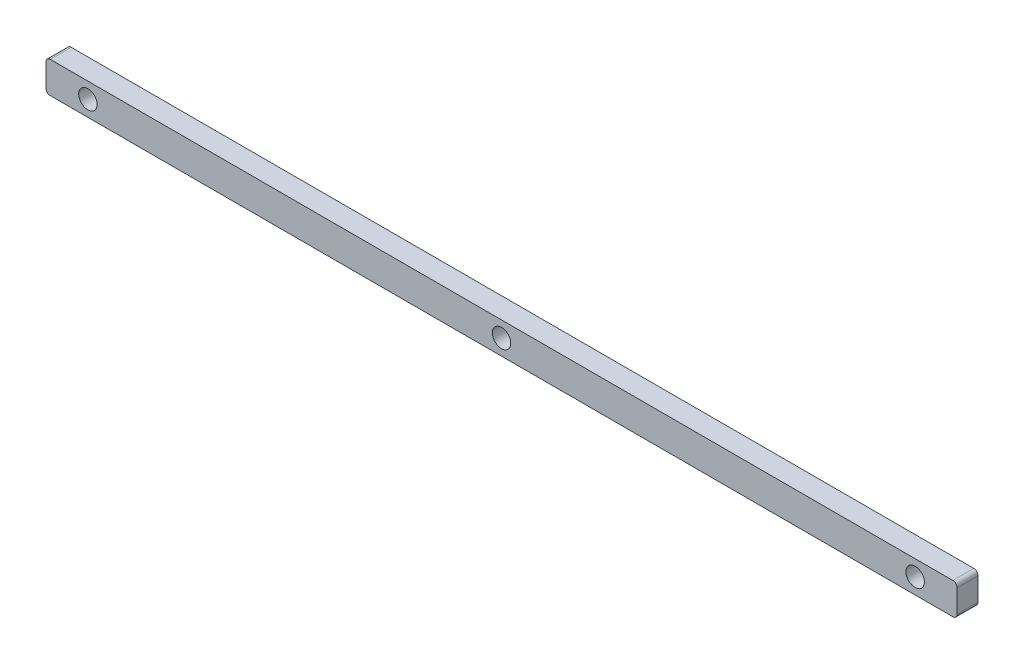
ISO-10303-21;
HEADER;
FILE_DESCRIPTION(('STEP AP214'),'2;1');
FILE_NAME('part.step','',(''),(''),'','','');
FILE_SCHEMA(('AUTOMOTIVE_DESIGN { 1 0 10303 214 1 1 1 1 }'));
ENDSEC;
DATA;
#1=APPLICATION_CONTEXT('core data for automotive mechanical design processes');
#2=APPLICATION_PROTOCOL_DEFINITION('international standard','automotive_design',2000,#1);
#3=PRODUCT_CONTEXT('',#1,'mechanical');
#4=PRODUCT('Part','Part','',(#3));
#5=PRODUCT_RELATED_PRODUCT_CATEGORY('part','',(#4));
#6=PRODUCT_DEFINITION_FORMATION('','',#4);
#7=PRODUCT_DEFINITION_CONTEXT('part definition',#1,'design');
#8=PRODUCT_DEFINITION('design','',#6,#7);
#9=PRODUCT_DEFINITION_SHAPE('','',#8);
#10=(LENGTH_UNIT() NAMED_UNIT(*) SI_UNIT(.MILLI.,.METRE.));
#11=(NAMED_UNIT(*) PLANE_ANGLE_UNIT() SI_UNIT($,.RADIAN.));
#12=(NAMED_UNIT(*) SI_UNIT($,.STERADIAN.) SOLID_ANGLE_UNIT());
#13=UNCERTAINTY_MEASURE_WITH_UNIT(LENGTH_MEASURE(1.E-05),#10,'distance_accuracy_value','');
#14=(GEOMETRIC_REPRESENTATION_CONTEXT(3) GLOBAL_UNCERTAINTY_ASSIGNED_CONTEXT((#13)) GLOBAL_UNIT_ASSIGNED_CONTEXT((#10,
#11,#12)) REPRESENTATION_CONTEXT('',''));
#15=CARTESIAN_POINT('',(0.,0.,0.));
#16=DIRECTION('',(0.,0.,1.));
#17=DIRECTION('',(1.,0.,0.));
#18=AXIS2_PLACEMENT_3D('',#15,#16,#17);
#19=CARTESIAN_POINT('',(0.,0.,6.35));
#20=DIRECTION('',(0.,0.,-1.));
#21=DIRECTION('',(-1.,0.,0.));
#22=AXIS2_PLACEMENT_3D('',#19,#20,#21);
#23=PLANE('',#22);
#24=DIRECTION('',(-1.,0.,0.));
#25=VECTOR('',#24,1.);
#26=CARTESIAN_POINT('',(-276.225,9.52500000000001,6.35));
#27=LINE('',#26,#25);
#28=CARTESIAN_POINT('',(273.685,9.52500000000001,6.35));
#29=VERTEX_POINT('',#28);
#30=CARTESIAN_POINT('',(-273.685,9.52500000000001,6.35));
#31=VERTEX_POINT('',#30);
#32=EDGE_CURVE('E194',#29,#31,#27,.T.);
#33=ORIENTED_EDGE('',*,*,#32,.T.);
#34=CARTESIAN_POINT('',(-273.685,6.985,6.35));
#35=DIRECTION('',(0.,0.,-1.));
#36=DIRECTION('',(-1.,0.,0.));
#37=AXIS2_PLACEMENT_3D('',#34,#35,#36);
#38=CIRCLE('',#37,2.54);
#39=CARTESIAN_POINT('',(-276.225,6.985,6.35));
#40=VERTEX_POINT('',#39);
#41=EDGE_CURVE('E170',#31,#40,#38,.F.);
#42=ORIENTED_EDGE('',*,*,#41,.T.);
#43=DIRECTION('',(0.,-1.,0.));
#44=VECTOR('',#43,1.);
#45=CARTESIAN_POINT('',(-276.225,-9.52499999999999,6.35));
#46=LINE('',#45,#44);
#47=CARTESIAN_POINT('',(-276.225,-6.98499999999999,6.35));
#48=VERTEX_POINT('',#47);
#49=EDGE_CURVE('E127',#40,#48,#46,.T.);
#50=ORIENTED_EDGE('',*,*,#49,.T.);
#51=CARTESIAN_POINT('',(-273.685,-6.98499999999999,6.35));
#52=DIRECTION('',(0.,0.,-1.));
#53=DIRECTION('',(-1.,0.,0.));
#54=AXIS2_PLACEMENT_3D('',#51,#52,#53);
#55=CIRCLE('',#54,2.54);
#56=CARTESIAN_POINT('',(-273.685,-9.52499999999999,6.35));
#57=VERTEX_POINT('',#56);
#58=EDGE_CURVE('E62',#48,#57,#55,.F.);
#59=ORIENTED_EDGE('',*,*,#58,.T.);
#60=DIRECTION('',(1.,0.,0.));
#61=VECTOR('',#60,1.);
#62=CARTESIAN_POINT('',(-276.225,-9.52499999999999,6.35));
#63=LINE('',#62,#61);
#64=CARTESIAN_POINT('',(273.685,-9.52499999999999,6.35));
#65=VERTEX_POINT('',#64);
#66=EDGE_CURVE('E148',#57,#65,#63,.T.);
#67=ORIENTED_EDGE('',*,*,#66,.T.);
#68=CARTESIAN_POINT('',(273.685,-6.98499999999999,6.35));
#69=DIRECTION('',(0.,0.,-1.));
#70=DIRECTION('',(-1.,0.,0.));
#71=AXIS2_PLACEMENT_3D('',#68,#69,#70);
#72=CIRCLE('',#71,2.54);
#73=CARTESIAN_POINT('',(276.225,-6.98499999999999,6.35));
#74=VERTEX_POINT('',#73);
#75=EDGE_CURVE('E165',#65,#74,#72,.F.);
#76=ORIENTED_EDGE('',*,*,#75,.T.);
#77=DIRECTION('',(0.,1.,0.));
#78=VECTOR('',#77,1.);
#79=CARTESIAN_POINT('',(276.225,-9.52499999999999,6.35));
#80=LINE('',#79,#78);
#81=CARTESIAN_POINT('',(276.225,6.985,6.35));
#82=VERTEX_POINT('',#81);
#83=EDGE_CURVE('E141',#74,#82,#80,.T.);
#84=ORIENTED_EDGE('',*,*,#83,.T.);
#85=CARTESIAN_POINT('',(273.685,6.985,6.35));
#86=DIRECTION('',(0.,0.,-1.));
#87=DIRECTION('',(-1.,0.,0.));
#88=AXIS2_PLACEMENT_3D('',#85,#86,#87);
#89=CIRCLE('',#88,2.54);
#90=EDGE_CURVE('E162',#82,#29,#89,.F.);
#91=ORIENTED_EDGE('',*,*,#90,.T.);
#92=EDGE_LOOP('',(#33,#42,#50,#59,#67,#76,#84,#91));
#93=FACE_BOUND('',#92,.T.);
#94=CARTESIAN_POINT('',(0.,0.,6.35));
#95=DIRECTION('',(0.,0.,1.));
#96=DIRECTION('',(1.,0.,0.));
#97=AXIS2_PLACEMENT_3D('',#94,#95,#96);
#98=CIRCLE('',#97,5.588);
#99=CARTESIAN_POINT('',(5.588,0.,6.35));
#100=VERTEX_POINT('',#99);
#101=EDGE_CURVE('E200',#100,#100,#98,.T.);
#102=ORIENTED_EDGE('',*,*,#101,.F.);
#103=EDGE_LOOP('',(#102));
#104=FACE_BOUND('',#103,.T.);
#105=CARTESIAN_POINT('',(-250.825,0.,6.35));
#106=DIRECTION('',(0.,0.,1.));
#107=DIRECTION('',(1.,0.,0.));
#108=AXIS2_PLACEMENT_3D('',#105,#106,#107);
#109=CIRCLE('',#108,5.58800000000002);
#110=CARTESIAN_POINT('',(-245.237,0.,6.35));
#111=VERTEX_POINT('',#110);
#112=EDGE_CURVE('E214',#111,#111,#109,.T.);
#113=ORIENTED_EDGE('',*,*,#112,.F.);
#114=EDGE_LOOP('',(#113));
#115=FACE_BOUND('',#114,.T.);
#116=CARTESIAN_POINT('',(250.825,0.,6.35));
#117=DIRECTION('',(0.,0.,1.));
#118=DIRECTION('',(1.,0.,0.));
#119=AXIS2_PLACEMENT_3D('',#116,#117,#118);
#120=CIRCLE('',#119,5.58799999999997);
#121=CARTESIAN_POINT('',(256.413,0.,6.35));
#122=VERTEX_POINT('',#121);
#123=EDGE_CURVE('E220',#122,#122,#120,.T.);
#124=ORIENTED_EDGE('',*,*,#123,.F.);
#125=EDGE_LOOP('',(#124));
#126=FACE_BOUND('',#125,.T.);
#127=ADVANCED_FACE('F39',(#93,#104,#115,#126),#23,.F.);
#128=CARTESIAN_POINT('',(0.,0.,-6.35));
#129=DIRECTION('',(0.,0.,-1.));
#130=DIRECTION('',(-1.,0.,0.));
#131=AXIS2_PLACEMENT_3D('',#128,#129,#130);
#132=PLANE('',#131);
#133=CARTESIAN_POINT('',(-250.825,0.,-6.35));
#134=DIRECTION('',(0.,0.,1.));
#135=DIRECTION('',(1.,0.,0.));
#136=AXIS2_PLACEMENT_3D('',#133,#134,#135);
#137=CIRCLE('',#136,5.58800000000002);
#138=CARTESIAN_POINT('',(-245.237,0.,-6.35));
#139=VERTEX_POINT('',#138);
#140=EDGE_CURVE('E216',#139,#139,#137,.T.);
#141=ORIENTED_EDGE('',*,*,#140,.T.);
#142=EDGE_LOOP('',(#141));
#143=FACE_BOUND('',#142,.T.);
#144=DIRECTION('',(0.,-1.,0.));
#145=VECTOR('',#144,1.);
#146=CARTESIAN_POINT('',(-276.225,-9.52499999999999,-6.35));
#147=LINE('',#146,#145);
#148=CARTESIAN_POINT('',(-276.225,6.985,-6.35));
#149=VERTEX_POINT('',#148);
#150=CARTESIAN_POINT('',(-276.225,-6.98499999999999,-6.35));
#151=VERTEX_POINT('',#150);
#152=EDGE_CURVE('E125',#149,#151,#147,.T.);
#153=ORIENTED_EDGE('',*,*,#152,.F.);
#154=CARTESIAN_POINT('',(-273.685,6.985,-6.35));
#155=DIRECTION('',(0.,0.,-1.));
#156=DIRECTION('',(-1.,0.,0.));
#157=AXIS2_PLACEMENT_3D('',#154,#155,#156);
#158=CIRCLE('',#157,2.54);
#159=CARTESIAN_POINT('',(-273.685,9.52500000000001,-6.35));
#160=VERTEX_POINT('',#159);
#161=EDGE_CURVE('E107',#149,#160,#158,.T.);
#162=ORIENTED_EDGE('',*,*,#161,.T.);
#163=DIRECTION('',(-1.,0.,0.));
#164=VECTOR('',#163,1.);
#165=CARTESIAN_POINT('',(-276.225,9.52500000000001,-6.35));
#166=LINE('',#165,#164);
#167=CARTESIAN_POINT('',(273.685,9.52500000000001,-6.35));
#168=VERTEX_POINT('',#167);
#169=EDGE_CURVE('E137',#168,#160,#166,.T.);
#170=ORIENTED_EDGE('',*,*,#169,.F.);
#171=CARTESIAN_POINT('',(273.685,6.985,-6.35));
#172=DIRECTION('',(0.,0.,-1.));
#173=DIRECTION('',(-1.,0.,0.));
#174=AXIS2_PLACEMENT_3D('',#171,#172,#173);
#175=CIRCLE('',#174,2.54);
#176=CARTESIAN_POINT('',(276.225,6.985,-6.35));
#177=VERTEX_POINT('',#176);
#178=EDGE_CURVE('E129',#168,#177,#175,.T.);
#179=ORIENTED_EDGE('',*,*,#178,.T.);
#180=DIRECTION('',(0.,1.,0.));
#181=VECTOR('',#180,1.);
#182=CARTESIAN_POINT('',(276.225,-9.52499999999999,-6.35));
#183=LINE('',#182,#181);
#184=CARTESIAN_POINT('',(276.225,-6.98499999999999,-6.35));
#185=VERTEX_POINT('',#184);
#186=EDGE_CURVE('E143',#185,#177,#183,.T.);
#187=ORIENTED_EDGE('',*,*,#186,.F.);
#188=CARTESIAN_POINT('',(273.685,-6.98499999999999,-6.35));
#189=DIRECTION('',(0.,0.,-1.));
#190=DIRECTION('',(-1.,0.,0.));
#191=AXIS2_PLACEMENT_3D('',#188,#189,#190);
#192=CIRCLE('',#191,2.54);
#193=CARTESIAN_POINT('',(273.685,-9.52499999999999,-6.35));
#194=VERTEX_POINT('',#193);
#195=EDGE_CURVE('E152',#185,#194,#192,.T.);
#196=ORIENTED_EDGE('',*,*,#195,.T.);
#197=DIRECTION('',(1.,0.,0.));
#198=VECTOR('',#197,1.);
#199=CARTESIAN_POINT('',(-276.225,-9.52499999999999,-6.35));
#200=LINE('',#199,#198);
#201=CARTESIAN_POINT('',(-273.685,-9.52499999999999,-6.35));
#202=VERTEX_POINT('',#201);
#203=EDGE_CURVE('E136',#202,#194,#200,.T.);
#204=ORIENTED_EDGE('',*,*,#203,.F.);
#205=CARTESIAN_POINT('',(-273.685,-6.98499999999999,-6.35));
#206=DIRECTION('',(0.,0.,-1.));
#207=DIRECTION('',(-1.,0.,0.));
#208=AXIS2_PLACEMENT_3D('',#205,#206,#207);
#209=CIRCLE('',#208,2.54);
#210=EDGE_CURVE('E119',#202,#151,#209,.T.);
#211=ORIENTED_EDGE('',*,*,#210,.T.);
#212=EDGE_LOOP('',(#153,#162,#170,#179,#187,#196,#204,#211));
#213=FACE_BOUND('',#212,.T.);
#214=CARTESIAN_POINT('',(0.,0.,-6.35));
#215=DIRECTION('',(0.,0.,1.));
#216=DIRECTION('',(1.,0.,0.));
#217=AXIS2_PLACEMENT_3D('',#214,#215,#216);
#218=CIRCLE('',#217,5.588);
#219=CARTESIAN_POINT('',(5.588,0.,-6.35));
#220=VERTEX_POINT('',#219);
#221=EDGE_CURVE('E203',#220,#220,#218,.T.);
#222=ORIENTED_EDGE('',*,*,#221,.T.);
#223=EDGE_LOOP('',(#222));
#224=FACE_BOUND('',#223,.T.);
#225=CARTESIAN_POINT('',(250.825,0.,-6.35));
#226=DIRECTION('',(0.,0.,1.));
#227=DIRECTION('',(1.,0.,0.));
#228=AXIS2_PLACEMENT_3D('',#225,#226,#227);
#229=CIRCLE('',#228,5.58799999999997);
#230=CARTESIAN_POINT('',(256.413,0.,-6.35));
#231=VERTEX_POINT('',#230);
#232=EDGE_CURVE('E224',#231,#231,#229,.T.);
#233=ORIENTED_EDGE('',*,*,#232,.T.);
#234=EDGE_LOOP('',(#233));
#235=FACE_BOUND('',#234,.T.);
#236=ADVANCED_FACE('F132',(#143,#213,#224,#235),#132,.T.);
#237=CARTESIAN_POINT('',(276.225,-9.52499999999999,6.35));
#238=DIRECTION('',(-1.,0.,0.));
#239=DIRECTION('',(0.,0.,1.));
#240=AXIS2_PLACEMENT_3D('',#237,#238,#239);
#241=PLANE('',#240);
#242=ORIENTED_EDGE('',*,*,#83,.F.);
#243=DIRECTION('',(0.,0.,-1.));
#244=VECTOR('',#243,1.);
#245=CARTESIAN_POINT('',(276.225,-6.98499999999999,6.35));
#246=LINE('',#245,#244);
#247=EDGE_CURVE('E11',#74,#185,#246,.T.);
#248=ORIENTED_EDGE('',*,*,#247,.T.);
#249=ORIENTED_EDGE('',*,*,#186,.T.);
#250=DIRECTION('',(0.,0.,-1.));
#251=VECTOR('',#250,1.);
#252=CARTESIAN_POINT('',(276.225,6.985,6.35));
#253=LINE('',#252,#251);
#254=EDGE_CURVE('E48',#177,#82,#253,.F.);
#255=ORIENTED_EDGE('',*,*,#254,.T.);
#256=EDGE_LOOP('',(#242,#248,#249,#255));
#257=FACE_BOUND('',#256,.T.);
#258=ADVANCED_FACE('F184',(#257),#241,.F.);
#259=CARTESIAN_POINT('',(-276.225,9.52500000000001,6.35));
#260=DIRECTION('',(0.,-1.,0.));
#261=DIRECTION('',(0.,0.,-1.));
#262=AXIS2_PLACEMENT_3D('',#259,#260,#261);
#263=PLANE('',#262);
#264=ORIENTED_EDGE('',*,*,#169,.T.);
#265=DIRECTION('',(0.,0.,-1.));
#266=VECTOR('',#265,1.);
#267=CARTESIAN_POINT('',(-273.685,9.52500000000001,6.35));
#268=LINE('',#267,#266);
#269=EDGE_CURVE('E112',#160,#31,#268,.F.);
#270=ORIENTED_EDGE('',*,*,#269,.T.);
#271=ORIENTED_EDGE('',*,*,#32,.F.);
#272=DIRECTION('',(0.,0.,-1.));
#273=VECTOR('',#272,1.);
#274=CARTESIAN_POINT('',(273.685,9.52500000000001,6.35));
#275=LINE('',#274,#273);
#276=EDGE_CURVE('E118',#29,#168,#275,.T.);
#277=ORIENTED_EDGE('',*,*,#276,.T.);
#278=EDGE_LOOP('',(#264,#270,#271,#277));
#279=FACE_BOUND('',#278,.T.);
#280=ADVANCED_FACE('F198',(#279),#263,.F.);
#281=CARTESIAN_POINT('',(-276.225,-9.52499999999999,6.35));
#282=DIRECTION('',(1.,0.,0.));
#283=DIRECTION('',(0.,0.,-1.));
#284=AXIS2_PLACEMENT_3D('',#281,#282,#283);
#285=PLANE('',#284);
#286=ORIENTED_EDGE('',*,*,#49,.F.);
#287=DIRECTION('',(0.,0.,-1.));
#288=VECTOR('',#287,1.);
#289=CARTESIAN_POINT('',(-276.225,6.985,6.35));
#290=LINE('',#289,#288);
#291=EDGE_CURVE('E111',#40,#149,#290,.T.);
#292=ORIENTED_EDGE('',*,*,#291,.T.);
#293=ORIENTED_EDGE('',*,*,#152,.T.);
#294=DIRECTION('',(0.,0.,-1.));
#295=VECTOR('',#294,1.);
#296=CARTESIAN_POINT('',(-276.225,-6.98499999999999,6.35));
#297=LINE('',#296,#295);
#298=EDGE_CURVE('E130',#151,#48,#297,.F.);
#299=ORIENTED_EDGE('',*,*,#298,.T.);
#300=EDGE_LOOP('',(#286,#292,#293,#299));
#301=FACE_BOUND('',#300,.T.);
#302=ADVANCED_FACE('F124',(#301),#285,.F.);
#303=CARTESIAN_POINT('',(-276.225,-9.52499999999999,6.35));
#304=DIRECTION('',(0.,1.,0.));
#305=DIRECTION('',(0.,0.,1.));
#306=AXIS2_PLACEMENT_3D('',#303,#304,#305);
#307=PLANE('',#306);
#308=ORIENTED_EDGE('',*,*,#66,.F.);
#309=DIRECTION('',(0.,0.,-1.));
#310=VECTOR('',#309,1.);
#311=CARTESIAN_POINT('',(-273.685,-9.52499999999999,6.35));
#312=LINE('',#311,#310);
#313=EDGE_CURVE('E175',#57,#202,#312,.T.);
#314=ORIENTED_EDGE('',*,*,#313,.T.);
#315=ORIENTED_EDGE('',*,*,#203,.T.);
#316=DIRECTION('',(0.,0.,-1.));
#317=VECTOR('',#316,1.);
#318=CARTESIAN_POINT('',(273.685,-9.52499999999999,6.35));
#319=LINE('',#318,#317);
#320=EDGE_CURVE('E55',#194,#65,#319,.F.);
#321=ORIENTED_EDGE('',*,*,#320,.T.);
#322=EDGE_LOOP('',(#308,#314,#315,#321));
#323=FACE_BOUND('',#322,.T.);
#324=ADVANCED_FACE('F246',(#323),#307,.F.);
#325=CARTESIAN_POINT('',(0.,0.,6.35));
#326=DIRECTION('',(0.,0.,-1.));
#327=DIRECTION('',(-1.,0.,0.));
#328=AXIS2_PLACEMENT_3D('',#325,#326,#327);
#329=CYLINDRICAL_SURFACE('',#328,5.588);
#330=ORIENTED_EDGE('',*,*,#101,.T.);
#331=EDGE_LOOP('',(#330));
#332=FACE_BOUND('',#331,.T.);
#333=ORIENTED_EDGE('',*,*,#221,.F.);
#334=EDGE_LOOP('',(#333));
#335=FACE_BOUND('',#334,.T.);
#336=ADVANCED_FACE('F243',(#332,#335),#329,.F.);
#337=CARTESIAN_POINT('',(-250.825,0.,6.35));
#338=DIRECTION('',(0.,0.,-1.));
#339=DIRECTION('',(-1.,0.,0.));
#340=AXIS2_PLACEMENT_3D('',#337,#338,#339);
#341=CYLINDRICAL_SURFACE('',#340,5.58800000000002);
#342=ORIENTED_EDGE('',*,*,#112,.T.);
#343=EDGE_LOOP('',(#342));
#344=FACE_BOUND('',#343,.T.);
#345=ORIENTED_EDGE('',*,*,#140,.F.);
#346=EDGE_LOOP('',(#345));
#347=FACE_BOUND('',#346,.T.);
#348=ADVANCED_FACE('F329',(#344,#347),#341,.F.);
#349=CARTESIAN_POINT('',(250.825,0.,6.35));
#350=DIRECTION('',(0.,0.,-1.));
#351=DIRECTION('',(-1.,0.,0.));
#352=AXIS2_PLACEMENT_3D('',#349,#350,#351);
#353=CYLINDRICAL_SURFACE('',#352,5.58799999999997);
#354=ORIENTED_EDGE('',*,*,#123,.T.);
#355=EDGE_LOOP('',(#354));
#356=FACE_BOUND('',#355,.T.);
#357=ORIENTED_EDGE('',*,*,#232,.F.);
#358=EDGE_LOOP('',(#357));
#359=FACE_BOUND('',#358,.T.);
#360=ADVANCED_FACE('F232',(#356,#359),#353,.F.);
#361=CARTESIAN_POINT('',(-273.685,6.985,6.35));
#362=DIRECTION('',(0.,0.,-1.));
#363=DIRECTION('',(-1.,0.,0.));
#364=AXIS2_PLACEMENT_3D('',#361,#362,#363);
#365=CYLINDRICAL_SURFACE('',#364,2.54);
#366=ORIENTED_EDGE('',*,*,#41,.F.);
#367=ORIENTED_EDGE('',*,*,#269,.F.);
#368=ORIENTED_EDGE('',*,*,#161,.F.);
#369=ORIENTED_EDGE('',*,*,#291,.F.);
#370=EDGE_LOOP('',(#366,#367,#368,#369));
#371=FACE_BOUND('',#370,.T.);
#372=ADVANCED_FACE('F110',(#371),#365,.T.);
#373=CARTESIAN_POINT('',(-273.685,-6.98499999999999,6.35));
#374=DIRECTION('',(0.,0.,-1.));
#375=DIRECTION('',(-1.,0.,0.));
#376=AXIS2_PLACEMENT_3D('',#373,#374,#375);
#377=CYLINDRICAL_SURFACE('',#376,2.54);
#378=ORIENTED_EDGE('',*,*,#58,.F.);
#379=ORIENTED_EDGE('',*,*,#298,.F.);
#380=ORIENTED_EDGE('',*,*,#210,.F.);
#381=ORIENTED_EDGE('',*,*,#313,.F.);
#382=EDGE_LOOP('',(#378,#379,#380,#381));
#383=FACE_BOUND('',#382,.T.);
#384=ADVANCED_FACE('F257',(#383),#377,.T.);
#385=CARTESIAN_POINT('',(273.685,-6.98499999999999,6.35));
#386=DIRECTION('',(0.,0.,-1.));
#387=DIRECTION('',(-1.,0.,0.));
#388=AXIS2_PLACEMENT_3D('',#385,#386,#387);
#389=CYLINDRICAL_SURFACE('',#388,2.54);
#390=ORIENTED_EDGE('',*,*,#75,.F.);
#391=ORIENTED_EDGE('',*,*,#320,.F.);
#392=ORIENTED_EDGE('',*,*,#195,.F.);
#393=ORIENTED_EDGE('',*,*,#247,.F.);
#394=EDGE_LOOP('',(#390,#391,#392,#393));
#395=FACE_BOUND('',#394,.T.);
#396=ADVANCED_FACE('F259',(#395),#389,.T.);
#397=CARTESIAN_POINT('',(273.685,6.985,6.35));
#398=DIRECTION('',(0.,0.,-1.));
#399=DIRECTION('',(-1.,0.,0.));
#400=AXIS2_PLACEMENT_3D('',#397,#398,#399);
#401=CYLINDRICAL_SURFACE('',#400,2.54);
#402=ORIENTED_EDGE('',*,*,#90,.F.);
#403=ORIENTED_EDGE('',*,*,#254,.F.);
#404=ORIENTED_EDGE('',*,*,#178,.F.);
#405=ORIENTED_EDGE('',*,*,#276,.F.);
#406=EDGE_LOOP('',(#402,#403,#404,#405));
#407=FACE_BOUND('',#406,.T.);
#408=ADVANCED_FACE('F41',(#407),#401,.T.);
#409=CLOSED_SHELL('',(#127,#236,#258,#280,#302,#324,#336,#348,#360,#372,#384,#396,#408));
#410=MANIFOLD_SOLID_BREP('B2',#409);
#411=ADVANCED_BREP_SHAPE_REPRESENTATION('',(#18,#410),#14);
#412=SHAPE_DEFINITION_REPRESENTATION(#9,#411);
ENDSEC;
END-ISO-10303-21;
